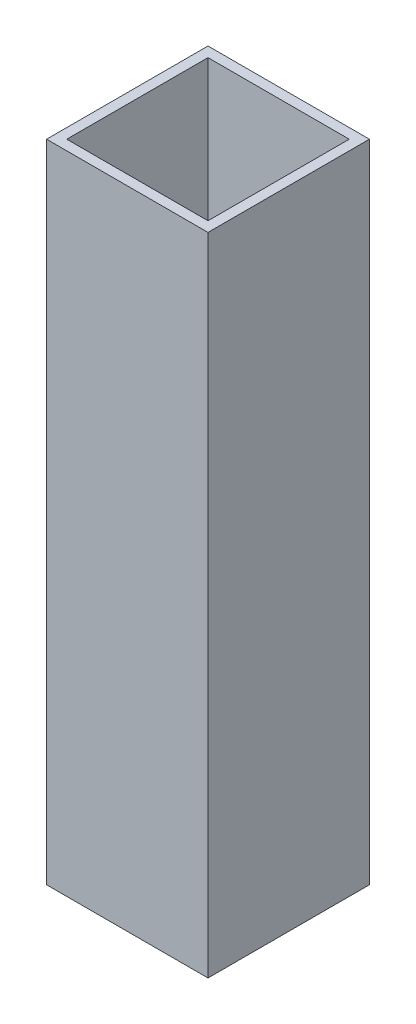
ISO-10303-21;
HEADER;
FILE_DESCRIPTION(('STEP AP214'),'2;1');
FILE_NAME('part.step','',(''),(''),'','','');
FILE_SCHEMA(('AUTOMOTIVE_DESIGN { 1 0 10303 214 1 1 1 1 }'));
ENDSEC;
DATA;
#1=APPLICATION_CONTEXT('core data for automotive mechanical design processes');
#2=APPLICATION_PROTOCOL_DEFINITION('international standard','automotive_design',2000,#1);
#3=PRODUCT_CONTEXT('',#1,'mechanical');
#4=PRODUCT('Part','Part','',(#3));
#5=PRODUCT_RELATED_PRODUCT_CATEGORY('part','',(#4));
#6=PRODUCT_DEFINITION_FORMATION('','',#4);
#7=PRODUCT_DEFINITION_CONTEXT('part definition',#1,'design');
#8=PRODUCT_DEFINITION('design','',#6,#7);
#9=PRODUCT_DEFINITION_SHAPE('','',#8);
#10=(LENGTH_UNIT() NAMED_UNIT(*) SI_UNIT(.MILLI.,.METRE.));
#11=(NAMED_UNIT(*) PLANE_ANGLE_UNIT() SI_UNIT($,.RADIAN.));
#12=(NAMED_UNIT(*) SI_UNIT($,.STERADIAN.) SOLID_ANGLE_UNIT());
#13=UNCERTAINTY_MEASURE_WITH_UNIT(LENGTH_MEASURE(1.E-05),#10,'distance_accuracy_value','');
#14=(GEOMETRIC_REPRESENTATION_CONTEXT(3) GLOBAL_UNCERTAINTY_ASSIGNED_CONTEXT((#13)) GLOBAL_UNIT_ASSIGNED_CONTEXT((#10,
#11,#12)) REPRESENTATION_CONTEXT('',''));
#15=CARTESIAN_POINT('',(0.,0.,0.));
#16=DIRECTION('',(0.,0.,1.));
#17=DIRECTION('',(1.,0.,0.));
#18=AXIS2_PLACEMENT_3D('',#15,#16,#17);
#19=CARTESIAN_POINT('',(0.,101.6,0.));
#20=DIRECTION('',(0.,1.,0.));
#21=DIRECTION('',(0.,0.,1.));
#22=AXIS2_PLACEMENT_3D('',#19,#20,#21);
#23=PLANE('',#22);
#24=DIRECTION('',(0.,0.,1.));
#25=VECTOR('',#24,1.);
#26=CARTESIAN_POINT('',(-12.7,101.6,12.7));
#27=LINE('',#26,#25);
#28=CARTESIAN_POINT('',(-12.7,101.6,-12.7));
#29=VERTEX_POINT('',#28);
#30=CARTESIAN_POINT('',(-12.7,101.6,12.7));
#31=VERTEX_POINT('',#30);
#32=EDGE_CURVE('E134',#29,#31,#27,.T.);
#33=ORIENTED_EDGE('',*,*,#32,.T.);
#34=DIRECTION('',(1.,0.,0.));
#35=VECTOR('',#34,1.);
#36=CARTESIAN_POINT('',(12.7,101.6,12.7));
#37=LINE('',#36,#35);
#38=CARTESIAN_POINT('',(12.7,101.6,12.7));
#39=VERTEX_POINT('',#38);
#40=EDGE_CURVE('E137',#31,#39,#37,.T.);
#41=ORIENTED_EDGE('',*,*,#40,.T.);
#42=DIRECTION('',(0.,0.,-1.));
#43=VECTOR('',#42,1.);
#44=CARTESIAN_POINT('',(12.7,101.6,12.7));
#45=LINE('',#44,#43);
#46=CARTESIAN_POINT('',(12.7,101.6,-12.7));
#47=VERTEX_POINT('',#46);
#48=EDGE_CURVE('E140',#39,#47,#45,.T.);
#49=ORIENTED_EDGE('',*,*,#48,.T.);
#50=DIRECTION('',(-1.,0.,0.));
#51=VECTOR('',#50,1.);
#52=CARTESIAN_POINT('',(12.7,101.6,-12.7));
#53=LINE('',#52,#51);
#54=EDGE_CURVE('E142',#47,#29,#53,.T.);
#55=ORIENTED_EDGE('',*,*,#54,.T.);
#56=EDGE_LOOP('',(#33,#41,#49,#55));
#57=FACE_BOUND('',#56,.T.);
#58=DIRECTION('',(1.,0.,0.));
#59=VECTOR('',#58,1.);
#60=CARTESIAN_POINT('',(11.1125,101.6,11.1125));
#61=LINE('',#60,#59);
#62=CARTESIAN_POINT('',(-11.1125,101.6,11.1125));
#63=VERTEX_POINT('',#62);
#64=CARTESIAN_POINT('',(11.1125,101.6,11.1125));
#65=VERTEX_POINT('',#64);
#66=EDGE_CURVE('E106',#63,#65,#61,.T.);
#67=ORIENTED_EDGE('',*,*,#66,.F.);
#68=DIRECTION('',(0.,0.,1.));
#69=VECTOR('',#68,1.);
#70=CARTESIAN_POINT('',(-11.1125,101.6,11.1125));
#71=LINE('',#70,#69);
#72=CARTESIAN_POINT('',(-11.1125,101.6,-11.1125));
#73=VERTEX_POINT('',#72);
#74=EDGE_CURVE('E98',#73,#63,#71,.T.);
#75=ORIENTED_EDGE('',*,*,#74,.F.);
#76=DIRECTION('',(-1.,0.,0.));
#77=VECTOR('',#76,1.);
#78=CARTESIAN_POINT('',(11.1125,101.6,-11.1125));
#79=LINE('',#78,#77);
#80=CARTESIAN_POINT('',(11.1125,101.6,-11.1125));
#81=VERTEX_POINT('',#80);
#82=EDGE_CURVE('E120',#81,#73,#79,.T.);
#83=ORIENTED_EDGE('',*,*,#82,.F.);
#84=DIRECTION('',(0.,0.,-1.));
#85=VECTOR('',#84,1.);
#86=CARTESIAN_POINT('',(11.1125,101.6,11.1125));
#87=LINE('',#86,#85);
#88=EDGE_CURVE('E118',#65,#81,#87,.T.);
#89=ORIENTED_EDGE('',*,*,#88,.F.);
#90=EDGE_LOOP('',(#67,#75,#83,#89));
#91=FACE_BOUND('',#90,.T.);
#92=ADVANCED_FACE('F33',(#57,#91),#23,.T.);
#93=CARTESIAN_POINT('',(0.,0.,0.));
#94=DIRECTION('',(0.,1.,0.));
#95=DIRECTION('',(0.,0.,1.));
#96=AXIS2_PLACEMENT_3D('',#93,#94,#95);
#97=PLANE('',#96);
#98=DIRECTION('',(0.,0.,1.));
#99=VECTOR('',#98,1.);
#100=CARTESIAN_POINT('',(-12.7,0.,12.7));
#101=LINE('',#100,#99);
#102=CARTESIAN_POINT('',(-12.7,0.,-12.7));
#103=VERTEX_POINT('',#102);
#104=CARTESIAN_POINT('',(-12.7,0.,12.7));
#105=VERTEX_POINT('',#104);
#106=EDGE_CURVE('E114',#103,#105,#101,.T.);
#107=ORIENTED_EDGE('',*,*,#106,.F.);
#108=DIRECTION('',(-1.,0.,0.));
#109=VECTOR('',#108,1.);
#110=CARTESIAN_POINT('',(12.7,0.,-12.7));
#111=LINE('',#110,#109);
#112=CARTESIAN_POINT('',(12.7,0.,-12.7));
#113=VERTEX_POINT('',#112);
#114=EDGE_CURVE('E138',#113,#103,#111,.T.);
#115=ORIENTED_EDGE('',*,*,#114,.F.);
#116=DIRECTION('',(0.,0.,-1.));
#117=VECTOR('',#116,1.);
#118=CARTESIAN_POINT('',(12.7,0.,12.7));
#119=LINE('',#118,#117);
#120=CARTESIAN_POINT('',(12.7,0.,12.7));
#121=VERTEX_POINT('',#120);
#122=EDGE_CURVE('E149',#121,#113,#119,.T.);
#123=ORIENTED_EDGE('',*,*,#122,.F.);
#124=DIRECTION('',(1.,0.,0.));
#125=VECTOR('',#124,1.);
#126=CARTESIAN_POINT('',(12.7,0.,12.7));
#127=LINE('',#126,#125);
#128=EDGE_CURVE('E147',#105,#121,#127,.T.);
#129=ORIENTED_EDGE('',*,*,#128,.F.);
#130=EDGE_LOOP('',(#107,#115,#123,#129));
#131=FACE_BOUND('',#130,.T.);
#132=DIRECTION('',(0.,0.,1.));
#133=VECTOR('',#132,1.);
#134=CARTESIAN_POINT('',(-11.1125,0.,11.1125));
#135=LINE('',#134,#133);
#136=CARTESIAN_POINT('',(-11.1125,0.,-11.1125));
#137=VERTEX_POINT('',#136);
#138=CARTESIAN_POINT('',(-11.1125,0.,11.1125));
#139=VERTEX_POINT('',#138);
#140=EDGE_CURVE('E56',#137,#139,#135,.T.);
#141=ORIENTED_EDGE('',*,*,#140,.T.);
#142=DIRECTION('',(1.,0.,0.));
#143=VECTOR('',#142,1.);
#144=CARTESIAN_POINT('',(11.1125,0.,11.1125));
#145=LINE('',#144,#143);
#146=CARTESIAN_POINT('',(11.1125,0.,11.1125));
#147=VERTEX_POINT('',#146);
#148=EDGE_CURVE('E113',#139,#147,#145,.T.);
#149=ORIENTED_EDGE('',*,*,#148,.T.);
#150=DIRECTION('',(0.,0.,-1.));
#151=VECTOR('',#150,1.);
#152=CARTESIAN_POINT('',(11.1125,0.,11.1125));
#153=LINE('',#152,#151);
#154=CARTESIAN_POINT('',(11.1125,0.,-11.1125));
#155=VERTEX_POINT('',#154);
#156=EDGE_CURVE('E126',#147,#155,#153,.T.);
#157=ORIENTED_EDGE('',*,*,#156,.T.);
#158=DIRECTION('',(-1.,0.,0.));
#159=VECTOR('',#158,1.);
#160=CARTESIAN_POINT('',(11.1125,0.,-11.1125));
#161=LINE('',#160,#159);
#162=EDGE_CURVE('E107',#155,#137,#161,.T.);
#163=ORIENTED_EDGE('',*,*,#162,.T.);
#164=EDGE_LOOP('',(#141,#149,#157,#163));
#165=FACE_BOUND('',#164,.T.);
#166=ADVANCED_FACE('F167',(#131,#165),#97,.F.);
#167=CARTESIAN_POINT('',(-12.7,101.6,12.7));
#168=DIRECTION('',(1.,0.,0.));
#169=DIRECTION('',(0.,0.,-1.));
#170=AXIS2_PLACEMENT_3D('',#167,#168,#169);
#171=PLANE('',#170);
#172=ORIENTED_EDGE('',*,*,#106,.T.);
#173=DIRECTION('',(0.,-1.,0.));
#174=VECTOR('',#173,1.);
#175=CARTESIAN_POINT('',(-12.7,101.6,12.7));
#176=LINE('',#175,#174);
#177=EDGE_CURVE('E11',#31,#105,#176,.T.);
#178=ORIENTED_EDGE('',*,*,#177,.F.);
#179=ORIENTED_EDGE('',*,*,#32,.F.);
#180=DIRECTION('',(0.,-1.,0.));
#181=VECTOR('',#180,1.);
#182=CARTESIAN_POINT('',(-12.7,101.6,-12.7));
#183=LINE('',#182,#181);
#184=EDGE_CURVE('E144',#29,#103,#183,.T.);
#185=ORIENTED_EDGE('',*,*,#184,.T.);
#186=EDGE_LOOP('',(#172,#178,#179,#185));
#187=FACE_BOUND('',#186,.T.);
#188=ADVANCED_FACE('F35',(#187),#171,.F.);
#189=CARTESIAN_POINT('',(12.7,101.6,12.7));
#190=DIRECTION('',(0.,0.,-1.));
#191=DIRECTION('',(-1.,0.,0.));
#192=AXIS2_PLACEMENT_3D('',#189,#190,#191);
#193=PLANE('',#192);
#194=ORIENTED_EDGE('',*,*,#128,.T.);
#195=DIRECTION('',(0.,-1.,0.));
#196=VECTOR('',#195,1.);
#197=CARTESIAN_POINT('',(12.7,101.6,12.7));
#198=LINE('',#197,#196);
#199=EDGE_CURVE('E41',#39,#121,#198,.T.);
#200=ORIENTED_EDGE('',*,*,#199,.F.);
#201=ORIENTED_EDGE('',*,*,#40,.F.);
#202=ORIENTED_EDGE('',*,*,#177,.T.);
#203=EDGE_LOOP('',(#194,#200,#201,#202));
#204=FACE_BOUND('',#203,.T.);
#205=ADVANCED_FACE('F177',(#204),#193,.F.);
#206=CARTESIAN_POINT('',(12.7,101.6,12.7));
#207=DIRECTION('',(-1.,0.,0.));
#208=DIRECTION('',(0.,0.,1.));
#209=AXIS2_PLACEMENT_3D('',#206,#207,#208);
#210=PLANE('',#209);
#211=ORIENTED_EDGE('',*,*,#122,.T.);
#212=DIRECTION('',(0.,-1.,0.));
#213=VECTOR('',#212,1.);
#214=CARTESIAN_POINT('',(12.7,101.6,-12.7));
#215=LINE('',#214,#213);
#216=EDGE_CURVE('E154',#47,#113,#215,.T.);
#217=ORIENTED_EDGE('',*,*,#216,.F.);
#218=ORIENTED_EDGE('',*,*,#48,.F.);
#219=ORIENTED_EDGE('',*,*,#199,.T.);
#220=EDGE_LOOP('',(#211,#217,#218,#219));
#221=FACE_BOUND('',#220,.T.);
#222=ADVANCED_FACE('F161',(#221),#210,.F.);
#223=CARTESIAN_POINT('',(12.7,101.6,-12.7));
#224=DIRECTION('',(0.,0.,1.));
#225=DIRECTION('',(1.,0.,0.));
#226=AXIS2_PLACEMENT_3D('',#223,#224,#225);
#227=PLANE('',#226);
#228=ORIENTED_EDGE('',*,*,#114,.T.);
#229=ORIENTED_EDGE('',*,*,#184,.F.);
#230=ORIENTED_EDGE('',*,*,#54,.F.);
#231=ORIENTED_EDGE('',*,*,#216,.T.);
#232=EDGE_LOOP('',(#228,#229,#230,#231));
#233=FACE_BOUND('',#232,.T.);
#234=ADVANCED_FACE('F171',(#233),#227,.F.);
#235=CARTESIAN_POINT('',(-11.1125,101.6,11.1125));
#236=DIRECTION('',(1.,0.,0.));
#237=DIRECTION('',(0.,0.,-1.));
#238=AXIS2_PLACEMENT_3D('',#235,#236,#237);
#239=PLANE('',#238);
#240=ORIENTED_EDGE('',*,*,#140,.F.);
#241=DIRECTION('',(0.,-1.,0.));
#242=VECTOR('',#241,1.);
#243=CARTESIAN_POINT('',(-11.1125,101.6,-11.1125));
#244=LINE('',#243,#242);
#245=EDGE_CURVE('E102',#73,#137,#244,.T.);
#246=ORIENTED_EDGE('',*,*,#245,.F.);
#247=ORIENTED_EDGE('',*,*,#74,.T.);
#248=DIRECTION('',(0.,-1.,0.));
#249=VECTOR('',#248,1.);
#250=CARTESIAN_POINT('',(-11.1125,101.6,11.1125));
#251=LINE('',#250,#249);
#252=EDGE_CURVE('E101',#63,#139,#251,.T.);
#253=ORIENTED_EDGE('',*,*,#252,.T.);
#254=EDGE_LOOP('',(#240,#246,#247,#253));
#255=FACE_BOUND('',#254,.T.);
#256=ADVANCED_FACE('F100',(#255),#239,.T.);
#257=CARTESIAN_POINT('',(11.1125,101.6,11.1125));
#258=DIRECTION('',(0.,0.,-1.));
#259=DIRECTION('',(-1.,0.,0.));
#260=AXIS2_PLACEMENT_3D('',#257,#258,#259);
#261=PLANE('',#260);
#262=ORIENTED_EDGE('',*,*,#148,.F.);
#263=ORIENTED_EDGE('',*,*,#252,.F.);
#264=ORIENTED_EDGE('',*,*,#66,.T.);
#265=DIRECTION('',(0.,-1.,0.));
#266=VECTOR('',#265,1.);
#267=CARTESIAN_POINT('',(11.1125,101.6,11.1125));
#268=LINE('',#267,#266);
#269=EDGE_CURVE('E115',#65,#147,#268,.T.);
#270=ORIENTED_EDGE('',*,*,#269,.T.);
#271=EDGE_LOOP('',(#262,#263,#264,#270));
#272=FACE_BOUND('',#271,.T.);
#273=ADVANCED_FACE('F110',(#272),#261,.T.);
#274=CARTESIAN_POINT('',(11.1125,101.6,11.1125));
#275=DIRECTION('',(-1.,0.,0.));
#276=DIRECTION('',(0.,0.,1.));
#277=AXIS2_PLACEMENT_3D('',#274,#275,#276);
#278=PLANE('',#277);
#279=ORIENTED_EDGE('',*,*,#156,.F.);
#280=ORIENTED_EDGE('',*,*,#269,.F.);
#281=ORIENTED_EDGE('',*,*,#88,.T.);
#282=DIRECTION('',(0.,-1.,0.));
#283=VECTOR('',#282,1.);
#284=CARTESIAN_POINT('',(11.1125,101.6,-11.1125));
#285=LINE('',#284,#283);
#286=EDGE_CURVE('E48',#81,#155,#285,.T.);
#287=ORIENTED_EDGE('',*,*,#286,.T.);
#288=EDGE_LOOP('',(#279,#280,#281,#287));
#289=FACE_BOUND('',#288,.T.);
#290=ADVANCED_FACE('F200',(#289),#278,.T.);
#291=CARTESIAN_POINT('',(11.1125,101.6,-11.1125));
#292=DIRECTION('',(0.,0.,1.));
#293=DIRECTION('',(1.,0.,0.));
#294=AXIS2_PLACEMENT_3D('',#291,#292,#293);
#295=PLANE('',#294);
#296=ORIENTED_EDGE('',*,*,#162,.F.);
#297=ORIENTED_EDGE('',*,*,#286,.F.);
#298=ORIENTED_EDGE('',*,*,#82,.T.);
#299=ORIENTED_EDGE('',*,*,#245,.T.);
#300=EDGE_LOOP('',(#296,#297,#298,#299));
#301=FACE_BOUND('',#300,.T.);
#302=ADVANCED_FACE('F204',(#301),#295,.T.);
#303=CLOSED_SHELL('',(#92,#166,#188,#205,#222,#234,#256,#273,#290,#302));
#304=MANIFOLD_SOLID_BREP('B2',#303);
#305=ADVANCED_BREP_SHAPE_REPRESENTATION('',(#18,#304),#14);
#306=SHAPE_DEFINITION_REPRESENTATION(#9,#305);
ENDSEC;
END-ISO-10303-21;
